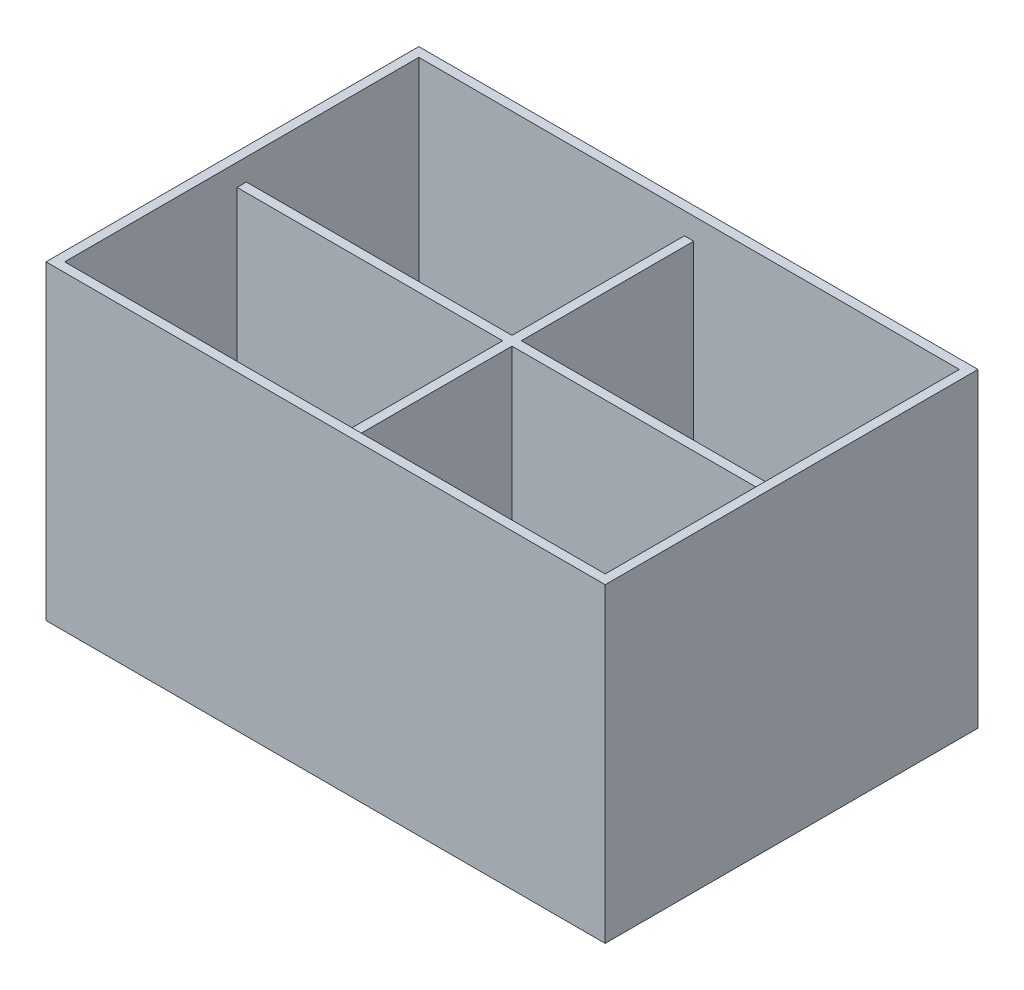
ISO-10303-21;
HEADER;
FILE_DESCRIPTION(('STEP AP214'),'2;1');
FILE_NAME('part.step','',(''),(''),'','','');
FILE_SCHEMA(('AUTOMOTIVE_DESIGN { 1 0 10303 214 1 1 1 1 }'));
ENDSEC;
DATA;
#1=APPLICATION_CONTEXT('core data for automotive mechanical design processes');
#2=APPLICATION_PROTOCOL_DEFINITION('international standard','automotive_design',2000,#1);
#3=PRODUCT_CONTEXT('',#1,'mechanical');
#4=PRODUCT('Part','Part','',(#3));
#5=PRODUCT_RELATED_PRODUCT_CATEGORY('part','',(#4));
#6=PRODUCT_DEFINITION_FORMATION('','',#4);
#7=PRODUCT_DEFINITION_CONTEXT('part definition',#1,'design');
#8=PRODUCT_DEFINITION('design','',#6,#7);
#9=PRODUCT_DEFINITION_SHAPE('','',#8);
#10=(LENGTH_UNIT() NAMED_UNIT(*) SI_UNIT(.MILLI.,.METRE.));
#11=(NAMED_UNIT(*) PLANE_ANGLE_UNIT() SI_UNIT($,.RADIAN.));
#12=(NAMED_UNIT(*) SI_UNIT($,.STERADIAN.) SOLID_ANGLE_UNIT());
#13=UNCERTAINTY_MEASURE_WITH_UNIT(LENGTH_MEASURE(1.E-05),#10,'distance_accuracy_value','');
#14=(GEOMETRIC_REPRESENTATION_CONTEXT(3) GLOBAL_UNCERTAINTY_ASSIGNED_CONTEXT((#13)) GLOBAL_UNIT_ASSIGNED_CONTEXT((#10,
#11,#12)) REPRESENTATION_CONTEXT('',''));
#15=CARTESIAN_POINT('',(0.,0.,0.));
#16=DIRECTION('',(0.,0.,1.));
#17=DIRECTION('',(1.,0.,0.));
#18=AXIS2_PLACEMENT_3D('',#15,#16,#17);
#19=CARTESIAN_POINT('',(0.,1.5,0.));
#20=DIRECTION('',(0.,1.,0.));
#21=DIRECTION('',(0.,0.,1.));
#22=AXIS2_PLACEMENT_3D('',#19,#20,#21);
#23=PLANE('',#22);
#24=DIRECTION('',(1.,0.,0.));
#25=VECTOR('',#24,1.);
#26=CARTESIAN_POINT('',(0.,1.5,0.749999999999972));
#27=LINE('',#26,#25);
#28=CARTESIAN_POINT('',(0.749999999999987,1.5,0.749999999999973));
#29=VERTEX_POINT('',#28);
#30=CARTESIAN_POINT('',(43.5,1.5,0.749999999999987));
#31=VERTEX_POINT('',#30);
#32=EDGE_CURVE('E52',#29,#31,#27,.T.);
#33=ORIENTED_EDGE('',*,*,#32,.F.);
#34=DIRECTION('',(0.,0.,-1.));
#35=VECTOR('',#34,1.);
#36=CARTESIAN_POINT('',(0.749999999999986,1.5,0.));
#37=LINE('',#36,#35);
#38=CARTESIAN_POINT('',(0.749999999999987,1.5,28.5));
#39=VERTEX_POINT('',#38);
#40=EDGE_CURVE('E198',#39,#29,#37,.T.);
#41=ORIENTED_EDGE('',*,*,#40,.F.);
#42=DIRECTION('',(1.,0.,0.));
#43=VECTOR('',#42,1.);
#44=CARTESIAN_POINT('',(-43.5,1.5,28.5));
#45=LINE('',#44,#43);
#46=CARTESIAN_POINT('',(43.5,1.5,28.5));
#47=VERTEX_POINT('',#46);
#48=EDGE_CURVE('E259',#39,#47,#45,.T.);
#49=ORIENTED_EDGE('',*,*,#48,.T.);
#50=DIRECTION('',(0.,0.,1.));
#51=VECTOR('',#50,1.);
#52=CARTESIAN_POINT('',(43.5,1.5,-28.5));
#53=LINE('',#52,#51);
#54=EDGE_CURVE('E262',#31,#47,#53,.T.);
#55=ORIENTED_EDGE('',*,*,#54,.F.);
#56=EDGE_LOOP('',(#33,#41,#49,#55));
#57=FACE_BOUND('',#56,.T.);
#58=ADVANCED_FACE('F37',(#57),#23,.T.);
#59=DIRECTION('',(1.,0.,0.));
#60=VECTOR('',#59,1.);
#61=CARTESIAN_POINT('',(0.,1.5,-0.750000000000029));
#62=LINE('',#61,#60);
#63=CARTESIAN_POINT('',(0.749999999999986,1.5,-0.750000000000028));
#64=VERTEX_POINT('',#63);
#65=CARTESIAN_POINT('',(43.5,1.5,-0.750000000000022));
#66=VERTEX_POINT('',#65);
#67=EDGE_CURVE('E289',#64,#66,#62,.T.);
#68=ORIENTED_EDGE('',*,*,#67,.T.);
#69=CARTESIAN_POINT('',(43.5,1.5,-28.5));
#70=VERTEX_POINT('',#69);
#71=EDGE_CURVE('E263',#70,#66,#53,.T.);
#72=ORIENTED_EDGE('',*,*,#71,.F.);
#73=DIRECTION('',(1.,0.,0.));
#74=VECTOR('',#73,1.);
#75=CARTESIAN_POINT('',(-43.5,1.5,-28.5));
#76=LINE('',#75,#74);
#77=CARTESIAN_POINT('',(0.749999999999994,1.5,-28.5));
#78=VERTEX_POINT('',#77);
#79=EDGE_CURVE('E45',#78,#70,#76,.T.);
#80=ORIENTED_EDGE('',*,*,#79,.F.);
#81=DIRECTION('',(0.,0.,-1.));
#82=VECTOR('',#81,1.);
#83=CARTESIAN_POINT('',(0.749999999999986,1.5,0.));
#84=LINE('',#83,#82);
#85=EDGE_CURVE('E60',#64,#78,#84,.T.);
#86=ORIENTED_EDGE('',*,*,#85,.F.);
#87=EDGE_LOOP('',(#68,#72,#80,#86));
#88=FACE_BOUND('',#87,.T.);
#89=ADVANCED_FACE('F287',(#88),#23,.T.);
#90=DIRECTION('',(0.,0.,-1.));
#91=VECTOR('',#90,1.);
#92=CARTESIAN_POINT('',(-0.750000000000015,1.5,0.));
#93=LINE('',#92,#91);
#94=CARTESIAN_POINT('',(-0.750000000000008,1.5,28.5));
#95=VERTEX_POINT('',#94);
#96=CARTESIAN_POINT('',(-0.750000000000014,1.5,0.749999999999973));
#97=VERTEX_POINT('',#96);
#98=EDGE_CURVE('E195',#95,#97,#93,.T.);
#99=ORIENTED_EDGE('',*,*,#98,.T.);
#100=DIRECTION('',(1.,0.,0.));
#101=VECTOR('',#100,1.);
#102=CARTESIAN_POINT('',(0.,1.5,0.749999999999972));
#103=LINE('',#102,#101);
#104=CARTESIAN_POINT('',(-43.5,1.5,0.74999999999998));
#105=VERTEX_POINT('',#104);
#106=EDGE_CURVE('E300',#105,#97,#103,.T.);
#107=ORIENTED_EDGE('',*,*,#106,.F.);
#108=DIRECTION('',(0.,0.,1.));
#109=VECTOR('',#108,1.);
#110=CARTESIAN_POINT('',(-43.5,1.5,-28.5));
#111=LINE('',#110,#109);
#112=CARTESIAN_POINT('',(-43.5,1.5,28.5));
#113=VERTEX_POINT('',#112);
#114=EDGE_CURVE('E255',#105,#113,#111,.T.);
#115=ORIENTED_EDGE('',*,*,#114,.T.);
#116=EDGE_CURVE('E260',#113,#95,#45,.T.);
#117=ORIENTED_EDGE('',*,*,#116,.T.);
#118=EDGE_LOOP('',(#99,#107,#115,#117));
#119=FACE_BOUND('',#118,.T.);
#120=ADVANCED_FACE('F362',(#119),#23,.T.);
#121=CARTESIAN_POINT('',(-43.5,50.,28.5));
#122=DIRECTION('',(0.,0.,-1.));
#123=DIRECTION('',(-1.,0.,0.));
#124=AXIS2_PLACEMENT_3D('',#121,#122,#123);
#125=PLANE('',#124);
#126=ORIENTED_EDGE('',*,*,#48,.F.);
#127=DIRECTION('',(0.,-1.,0.));
#128=VECTOR('',#127,1.);
#129=CARTESIAN_POINT('',(0.749999999999993,46.5,28.5));
#130=LINE('',#129,#128);
#131=CARTESIAN_POINT('',(0.749999999999987,46.5,28.5));
#132=VERTEX_POINT('',#131);
#133=EDGE_CURVE('E304',#132,#39,#130,.T.);
#134=ORIENTED_EDGE('',*,*,#133,.F.);
#135=DIRECTION('',(1.,0.,0.));
#136=VECTOR('',#135,1.);
#137=CARTESIAN_POINT('',(0.,46.5,28.5));
#138=LINE('',#137,#136);
#139=CARTESIAN_POINT('',(-0.750000000000008,46.5,28.5));
#140=VERTEX_POINT('',#139);
#141=EDGE_CURVE('E192',#140,#132,#138,.T.);
#142=ORIENTED_EDGE('',*,*,#141,.F.);
#143=DIRECTION('',(0.,-1.,0.));
#144=VECTOR('',#143,1.);
#145=CARTESIAN_POINT('',(-0.750000000000007,46.5,28.5));
#146=LINE('',#145,#144);
#147=EDGE_CURVE('E306',#140,#95,#146,.T.);
#148=ORIENTED_EDGE('',*,*,#147,.T.);
#149=ORIENTED_EDGE('',*,*,#116,.F.);
#150=DIRECTION('',(0.,-1.,0.));
#151=VECTOR('',#150,1.);
#152=CARTESIAN_POINT('',(-43.5,50.,28.5));
#153=LINE('',#152,#151);
#154=CARTESIAN_POINT('',(-43.5,50.,28.5));
#155=VERTEX_POINT('',#154);
#156=EDGE_CURVE('E222',#155,#113,#153,.T.);
#157=ORIENTED_EDGE('',*,*,#156,.F.);
#158=DIRECTION('',(1.,0.,0.));
#159=VECTOR('',#158,1.);
#160=CARTESIAN_POINT('',(-43.5,50.,28.5));
#161=LINE('',#160,#159);
#162=CARTESIAN_POINT('',(43.5,50.,28.5));
#163=VERTEX_POINT('',#162);
#164=EDGE_CURVE('E201',#155,#163,#161,.T.);
#165=ORIENTED_EDGE('',*,*,#164,.T.);
#166=DIRECTION('',(0.,-1.,0.));
#167=VECTOR('',#166,1.);
#168=CARTESIAN_POINT('',(43.5,50.,28.5));
#169=LINE('',#168,#167);
#170=EDGE_CURVE('E219',#163,#47,#169,.T.);
#171=ORIENTED_EDGE('',*,*,#170,.T.);
#172=EDGE_LOOP('',(#126,#134,#142,#148,#149,#157,#165,#171));
#173=FACE_BOUND('',#172,.T.);
#174=ADVANCED_FACE('F274',(#173),#125,.T.);
#175=CARTESIAN_POINT('',(43.5,50.,-28.5));
#176=DIRECTION('',(-1.,0.,0.));
#177=DIRECTION('',(0.,0.,1.));
#178=AXIS2_PLACEMENT_3D('',#175,#176,#177);
#179=PLANE('',#178);
#180=DIRECTION('',(0.,0.,-1.));
#181=VECTOR('',#180,1.);
#182=CARTESIAN_POINT('',(43.5,46.5,0.));
#183=LINE('',#182,#181);
#184=CARTESIAN_POINT('',(43.5,46.5,0.74999999999998));
#185=VERTEX_POINT('',#184);
#186=CARTESIAN_POINT('',(43.5,46.5,-0.750000000000015));
#187=VERTEX_POINT('',#186);
#188=EDGE_CURVE('E185',#185,#187,#183,.T.);
#189=ORIENTED_EDGE('',*,*,#188,.F.);
#190=DIRECTION('',(0.,-1.,0.));
#191=VECTOR('',#190,1.);
#192=CARTESIAN_POINT('',(43.5,46.5,0.749999999999986));
#193=LINE('',#192,#191);
#194=EDGE_CURVE('E182',#185,#31,#193,.T.);
#195=ORIENTED_EDGE('',*,*,#194,.T.);
#196=ORIENTED_EDGE('',*,*,#54,.T.);
#197=ORIENTED_EDGE('',*,*,#170,.F.);
#198=DIRECTION('',(0.,0.,-1.));
#199=VECTOR('',#198,1.);
#200=CARTESIAN_POINT('',(43.5,50.,-28.5));
#201=LINE('',#200,#199);
#202=CARTESIAN_POINT('',(43.5,50.,-28.5));
#203=VERTEX_POINT('',#202);
#204=EDGE_CURVE('E208',#163,#203,#201,.T.);
#205=ORIENTED_EDGE('',*,*,#204,.T.);
#206=DIRECTION('',(0.,-1.,0.));
#207=VECTOR('',#206,1.);
#208=CARTESIAN_POINT('',(43.5,50.,-28.5));
#209=LINE('',#208,#207);
#210=EDGE_CURVE('E216',#203,#70,#209,.T.);
#211=ORIENTED_EDGE('',*,*,#210,.T.);
#212=ORIENTED_EDGE('',*,*,#71,.T.);
#213=DIRECTION('',(0.,-1.,0.));
#214=VECTOR('',#213,1.);
#215=CARTESIAN_POINT('',(43.5,46.5,-0.750000000000014));
#216=LINE('',#215,#214);
#217=EDGE_CURVE('E203',#187,#66,#216,.T.);
#218=ORIENTED_EDGE('',*,*,#217,.F.);
#219=EDGE_LOOP('',(#189,#195,#196,#197,#205,#211,#212,#218));
#220=FACE_BOUND('',#219,.T.);
#221=ADVANCED_FACE('F270',(#220),#179,.T.);
#222=CARTESIAN_POINT('',(-43.5,50.,-28.5));
#223=DIRECTION('',(0.,0.,1.));
#224=DIRECTION('',(1.,0.,0.));
#225=AXIS2_PLACEMENT_3D('',#222,#223,#224);
#226=PLANE('',#225);
#227=DIRECTION('',(-1.,0.,0.));
#228=VECTOR('',#227,1.);
#229=CARTESIAN_POINT('',(0.,46.5,-28.5));
#230=LINE('',#229,#228);
#231=CARTESIAN_POINT('',(0.749999999999987,46.5,-28.5));
#232=VERTEX_POINT('',#231);
#233=CARTESIAN_POINT('',(-0.750000000000007,46.5,-28.5));
#234=VERTEX_POINT('',#233);
#235=EDGE_CURVE('E334',#232,#234,#230,.T.);
#236=ORIENTED_EDGE('',*,*,#235,.F.);
#237=DIRECTION('',(0.,-1.,0.));
#238=VECTOR('',#237,1.);
#239=CARTESIAN_POINT('',(0.749999999999993,46.5,-28.5));
#240=LINE('',#239,#238);
#241=EDGE_CURVE('E286',#232,#78,#240,.T.);
#242=ORIENTED_EDGE('',*,*,#241,.T.);
#243=ORIENTED_EDGE('',*,*,#79,.T.);
#244=ORIENTED_EDGE('',*,*,#210,.F.);
#245=DIRECTION('',(-1.,0.,0.));
#246=VECTOR('',#245,1.);
#247=CARTESIAN_POINT('',(-43.5,50.,-28.5));
#248=LINE('',#247,#246);
#249=CARTESIAN_POINT('',(-43.5,50.,-28.5));
#250=VERTEX_POINT('',#249);
#251=EDGE_CURVE('E211',#203,#250,#248,.T.);
#252=ORIENTED_EDGE('',*,*,#251,.T.);
#253=DIRECTION('',(0.,-1.,0.));
#254=VECTOR('',#253,1.);
#255=CARTESIAN_POINT('',(-43.5,50.,-28.5));
#256=LINE('',#255,#254);
#257=CARTESIAN_POINT('',(-43.5,1.5,-28.5));
#258=VERTEX_POINT('',#257);
#259=EDGE_CURVE('E213',#250,#258,#256,.T.);
#260=ORIENTED_EDGE('',*,*,#259,.T.);
#261=CARTESIAN_POINT('',(-0.750000000000008,1.5,-28.5));
#262=VERTEX_POINT('',#261);
#263=EDGE_CURVE('E11',#258,#262,#76,.T.);
#264=ORIENTED_EDGE('',*,*,#263,.T.);
#265=DIRECTION('',(0.,-1.,0.));
#266=VECTOR('',#265,1.);
#267=CARTESIAN_POINT('',(-0.750000000000007,46.5,-28.5));
#268=LINE('',#267,#266);
#269=EDGE_CURVE('E319',#234,#262,#268,.T.);
#270=ORIENTED_EDGE('',*,*,#269,.F.);
#271=EDGE_LOOP('',(#236,#242,#243,#244,#252,#260,#264,#270));
#272=FACE_BOUND('',#271,.T.);
#273=ADVANCED_FACE('F283',(#272),#226,.T.);
#274=DIRECTION('',(0.,0.,-1.));
#275=VECTOR('',#274,1.);
#276=CARTESIAN_POINT('',(-0.750000000000015,1.5,0.));
#277=LINE('',#276,#275);
#278=CARTESIAN_POINT('',(-0.750000000000014,1.5,-0.750000000000028));
#279=VERTEX_POINT('',#278);
#280=EDGE_CURVE('E292',#279,#262,#277,.T.);
#281=ORIENTED_EDGE('',*,*,#280,.T.);
#282=ORIENTED_EDGE('',*,*,#263,.F.);
#283=CARTESIAN_POINT('',(-43.5,1.5,-0.750000000000015));
#284=VERTEX_POINT('',#283);
#285=EDGE_CURVE('E256',#258,#284,#111,.T.);
#286=ORIENTED_EDGE('',*,*,#285,.T.);
#287=DIRECTION('',(1.,0.,0.));
#288=VECTOR('',#287,1.);
#289=CARTESIAN_POINT('',(0.,1.5,-0.750000000000029));
#290=LINE('',#289,#288);
#291=EDGE_CURVE('E298',#284,#279,#290,.T.);
#292=ORIENTED_EDGE('',*,*,#291,.T.);
#293=EDGE_LOOP('',(#281,#282,#286,#292));
#294=FACE_BOUND('',#293,.T.);
#295=ADVANCED_FACE('F375',(#294),#23,.T.);
#296=CARTESIAN_POINT('',(0.,50.,0.));
#297=DIRECTION('',(0.,1.,0.));
#298=DIRECTION('',(0.,0.,1.));
#299=AXIS2_PLACEMENT_3D('',#296,#297,#298);
#300=PLANE('',#299);
#301=DIRECTION('',(0.,0.,-1.));
#302=VECTOR('',#301,1.);
#303=CARTESIAN_POINT('',(45.,50.,-30.));
#304=LINE('',#303,#302);
#305=CARTESIAN_POINT('',(45.,50.,30.));
#306=VERTEX_POINT('',#305);
#307=CARTESIAN_POINT('',(45.,50.,-30.));
#308=VERTEX_POINT('',#307);
#309=EDGE_CURVE('E226',#306,#308,#304,.T.);
#310=ORIENTED_EDGE('',*,*,#309,.T.);
#311=DIRECTION('',(-1.,0.,0.));
#312=VECTOR('',#311,1.);
#313=CARTESIAN_POINT('',(-45.,50.,-30.));
#314=LINE('',#313,#312);
#315=CARTESIAN_POINT('',(-45.,50.,-30.));
#316=VERTEX_POINT('',#315);
#317=EDGE_CURVE('E229',#308,#316,#314,.T.);
#318=ORIENTED_EDGE('',*,*,#317,.T.);
#319=DIRECTION('',(0.,0.,1.));
#320=VECTOR('',#319,1.);
#321=CARTESIAN_POINT('',(-45.,50.,-30.));
#322=LINE('',#321,#320);
#323=CARTESIAN_POINT('',(-45.,50.,30.));
#324=VERTEX_POINT('',#323);
#325=EDGE_CURVE('E232',#316,#324,#322,.T.);
#326=ORIENTED_EDGE('',*,*,#325,.T.);
#327=DIRECTION('',(1.,0.,0.));
#328=VECTOR('',#327,1.);
#329=CARTESIAN_POINT('',(-45.,50.,30.));
#330=LINE('',#329,#328);
#331=EDGE_CURVE('E234',#324,#306,#330,.T.);
#332=ORIENTED_EDGE('',*,*,#331,.T.);
#333=EDGE_LOOP('',(#310,#318,#326,#332));
#334=FACE_BOUND('',#333,.T.);
#335=ORIENTED_EDGE('',*,*,#164,.F.);
#336=DIRECTION('',(0.,0.,1.));
#337=VECTOR('',#336,1.);
#338=CARTESIAN_POINT('',(-43.5,50.,-28.5));
#339=LINE('',#338,#337);
#340=EDGE_CURVE('E199',#250,#155,#339,.T.);
#341=ORIENTED_EDGE('',*,*,#340,.F.);
#342=ORIENTED_EDGE('',*,*,#251,.F.);
#343=ORIENTED_EDGE('',*,*,#204,.F.);
#344=EDGE_LOOP('',(#335,#341,#342,#343));
#345=FACE_BOUND('',#344,.T.);
#346=ADVANCED_FACE('F280',(#334,#345),#300,.T.);
#347=CARTESIAN_POINT('',(45.,50.,-30.));
#348=DIRECTION('',(-1.,0.,0.));
#349=DIRECTION('',(0.,0.,1.));
#350=AXIS2_PLACEMENT_3D('',#347,#348,#349);
#351=PLANE('',#350);
#352=DIRECTION('',(0.,0.,-1.));
#353=VECTOR('',#352,1.);
#354=CARTESIAN_POINT('',(45.,0.,-30.));
#355=LINE('',#354,#353);
#356=CARTESIAN_POINT('',(45.,0.,30.));
#357=VERTEX_POINT('',#356);
#358=CARTESIAN_POINT('',(45.,0.,-30.));
#359=VERTEX_POINT('',#358);
#360=EDGE_CURVE('E225',#357,#359,#355,.T.);
#361=ORIENTED_EDGE('',*,*,#360,.T.);
#362=DIRECTION('',(0.,-1.,0.));
#363=VECTOR('',#362,1.);
#364=CARTESIAN_POINT('',(45.,50.,-30.));
#365=LINE('',#364,#363);
#366=EDGE_CURVE('E252',#308,#359,#365,.T.);
#367=ORIENTED_EDGE('',*,*,#366,.F.);
#368=ORIENTED_EDGE('',*,*,#309,.F.);
#369=DIRECTION('',(0.,-1.,0.));
#370=VECTOR('',#369,1.);
#371=CARTESIAN_POINT('',(45.,50.,30.));
#372=LINE('',#371,#370);
#373=EDGE_CURVE('E236',#306,#357,#372,.T.);
#374=ORIENTED_EDGE('',*,*,#373,.T.);
#375=EDGE_LOOP('',(#361,#367,#368,#374));
#376=FACE_BOUND('',#375,.T.);
#377=ADVANCED_FACE('F381',(#376),#351,.F.);
#378=CARTESIAN_POINT('',(-45.,50.,-30.));
#379=DIRECTION('',(0.,0.,1.));
#380=DIRECTION('',(1.,0.,0.));
#381=AXIS2_PLACEMENT_3D('',#378,#379,#380);
#382=PLANE('',#381);
#383=DIRECTION('',(-1.,0.,0.));
#384=VECTOR('',#383,1.);
#385=CARTESIAN_POINT('',(-45.,0.,-30.));
#386=LINE('',#385,#384);
#387=CARTESIAN_POINT('',(-45.,0.,-30.));
#388=VERTEX_POINT('',#387);
#389=EDGE_CURVE('E239',#359,#388,#386,.T.);
#390=ORIENTED_EDGE('',*,*,#389,.T.);
#391=DIRECTION('',(0.,-1.,0.));
#392=VECTOR('',#391,1.);
#393=CARTESIAN_POINT('',(-45.,50.,-30.));
#394=LINE('',#393,#392);
#395=EDGE_CURVE('E249',#316,#388,#394,.T.);
#396=ORIENTED_EDGE('',*,*,#395,.F.);
#397=ORIENTED_EDGE('',*,*,#317,.F.);
#398=ORIENTED_EDGE('',*,*,#366,.T.);
#399=EDGE_LOOP('',(#390,#396,#397,#398));
#400=FACE_BOUND('',#399,.T.);
#401=ADVANCED_FACE('F433',(#400),#382,.F.);
#402=CARTESIAN_POINT('',(-45.,50.,-30.));
#403=DIRECTION('',(1.,0.,0.));
#404=DIRECTION('',(0.,0.,-1.));
#405=AXIS2_PLACEMENT_3D('',#402,#403,#404);
#406=PLANE('',#405);
#407=DIRECTION('',(0.,0.,1.));
#408=VECTOR('',#407,1.);
#409=CARTESIAN_POINT('',(-45.,0.,-30.));
#410=LINE('',#409,#408);
#411=CARTESIAN_POINT('',(-45.,0.,30.));
#412=VERTEX_POINT('',#411);
#413=EDGE_CURVE('E241',#388,#412,#410,.T.);
#414=ORIENTED_EDGE('',*,*,#413,.T.);
#415=DIRECTION('',(0.,-1.,0.));
#416=VECTOR('',#415,1.);
#417=CARTESIAN_POINT('',(-45.,50.,30.));
#418=LINE('',#417,#416);
#419=EDGE_CURVE('E246',#324,#412,#418,.T.);
#420=ORIENTED_EDGE('',*,*,#419,.F.);
#421=ORIENTED_EDGE('',*,*,#325,.F.);
#422=ORIENTED_EDGE('',*,*,#395,.T.);
#423=EDGE_LOOP('',(#414,#420,#421,#422));
#424=FACE_BOUND('',#423,.T.);
#425=ADVANCED_FACE('F423',(#424),#406,.F.);
#426=CARTESIAN_POINT('',(-45.,50.,30.));
#427=DIRECTION('',(0.,0.,-1.));
#428=DIRECTION('',(-1.,0.,0.));
#429=AXIS2_PLACEMENT_3D('',#426,#427,#428);
#430=PLANE('',#429);
#431=DIRECTION('',(1.,0.,0.));
#432=VECTOR('',#431,1.);
#433=CARTESIAN_POINT('',(-45.,0.,30.));
#434=LINE('',#433,#432);
#435=EDGE_CURVE('E230',#412,#357,#434,.T.);
#436=ORIENTED_EDGE('',*,*,#435,.T.);
#437=ORIENTED_EDGE('',*,*,#373,.F.);
#438=ORIENTED_EDGE('',*,*,#331,.F.);
#439=ORIENTED_EDGE('',*,*,#419,.T.);
#440=EDGE_LOOP('',(#436,#437,#438,#439));
#441=FACE_BOUND('',#440,.T.);
#442=ADVANCED_FACE('F418',(#441),#430,.F.);
#443=CARTESIAN_POINT('',(-43.5,50.,-28.5));
#444=DIRECTION('',(1.,0.,0.));
#445=DIRECTION('',(0.,0.,-1.));
#446=AXIS2_PLACEMENT_3D('',#443,#444,#445);
#447=PLANE('',#446);
#448=DIRECTION('',(0.,-1.,0.));
#449=VECTOR('',#448,1.);
#450=CARTESIAN_POINT('',(-43.5,46.5,-0.750000000000014));
#451=LINE('',#450,#449);
#452=CARTESIAN_POINT('',(-43.5,46.5,-0.750000000000022));
#453=VERTEX_POINT('',#452);
#454=EDGE_CURVE('E314',#453,#284,#451,.T.);
#455=ORIENTED_EDGE('',*,*,#454,.T.);
#456=ORIENTED_EDGE('',*,*,#285,.F.);
#457=ORIENTED_EDGE('',*,*,#259,.F.);
#458=ORIENTED_EDGE('',*,*,#340,.T.);
#459=ORIENTED_EDGE('',*,*,#156,.T.);
#460=ORIENTED_EDGE('',*,*,#114,.F.);
#461=DIRECTION('',(0.,-1.,0.));
#462=VECTOR('',#461,1.);
#463=CARTESIAN_POINT('',(-43.5,46.5,0.749999999999986));
#464=LINE('',#463,#462);
#465=CARTESIAN_POINT('',(-43.5,46.5,0.749999999999987));
#466=VERTEX_POINT('',#465);
#467=EDGE_CURVE('E311',#466,#105,#464,.T.);
#468=ORIENTED_EDGE('',*,*,#467,.F.);
#469=DIRECTION('',(0.,0.,1.));
#470=VECTOR('',#469,1.);
#471=CARTESIAN_POINT('',(-43.5,46.5,0.));
#472=LINE('',#471,#470);
#473=EDGE_CURVE('E343',#453,#466,#472,.T.);
#474=ORIENTED_EDGE('',*,*,#473,.F.);
#475=EDGE_LOOP('',(#455,#456,#457,#458,#459,#460,#468,#474));
#476=FACE_BOUND('',#475,.T.);
#477=ADVANCED_FACE('F364',(#476),#447,.T.);
#478=CARTESIAN_POINT('',(0.,0.,0.));
#479=DIRECTION('',(0.,1.,0.));
#480=DIRECTION('',(0.,0.,1.));
#481=AXIS2_PLACEMENT_3D('',#478,#479,#480);
#482=PLANE('',#481);
#483=ORIENTED_EDGE('',*,*,#360,.F.);
#484=ORIENTED_EDGE('',*,*,#435,.F.);
#485=ORIENTED_EDGE('',*,*,#413,.F.);
#486=ORIENTED_EDGE('',*,*,#389,.F.);
#487=EDGE_LOOP('',(#483,#484,#485,#486));
#488=FACE_BOUND('',#487,.T.);
#489=ADVANCED_FACE('F39',(#488),#482,.F.);
#490=CARTESIAN_POINT('',(0.749999999999986,46.5,0.));
#491=DIRECTION('',(-1.,0.,0.));
#492=DIRECTION('',(0.,0.,1.));
#493=AXIS2_PLACEMENT_3D('',#490,#491,#492);
#494=PLANE('',#493);
#495=ORIENTED_EDGE('',*,*,#40,.T.);
#496=DIRECTION('',(0.,-1.,0.));
#497=VECTOR('',#496,1.);
#498=CARTESIAN_POINT('',(0.749999999999987,46.5,0.749999999999973));
#499=LINE('',#498,#497);
#500=CARTESIAN_POINT('',(0.749999999999987,46.5,0.749999999999973));
#501=VERTEX_POINT('',#500);
#502=EDGE_CURVE('E180',#501,#29,#499,.T.);
#503=ORIENTED_EDGE('',*,*,#502,.F.);
#504=DIRECTION('',(0.,0.,-1.));
#505=VECTOR('',#504,1.);
#506=CARTESIAN_POINT('',(0.749999999999986,46.5,0.));
#507=LINE('',#506,#505);
#508=EDGE_CURVE('E186',#132,#501,#507,.T.);
#509=ORIENTED_EDGE('',*,*,#508,.F.);
#510=ORIENTED_EDGE('',*,*,#133,.T.);
#511=EDGE_LOOP('',(#495,#503,#509,#510));
#512=FACE_BOUND('',#511,.T.);
#513=ADVANCED_FACE('F197',(#512),#494,.F.);
#514=CARTESIAN_POINT('',(0.,46.5,0.749999999999972));
#515=DIRECTION('',(0.,0.,-1.));
#516=DIRECTION('',(-1.,0.,0.));
#517=AXIS2_PLACEMENT_3D('',#514,#515,#516);
#518=PLANE('',#517);
#519=ORIENTED_EDGE('',*,*,#32,.T.);
#520=ORIENTED_EDGE('',*,*,#194,.F.);
#521=DIRECTION('',(1.,0.,0.));
#522=VECTOR('',#521,1.);
#523=CARTESIAN_POINT('',(0.,46.5,0.749999999999972));
#524=LINE('',#523,#522);
#525=EDGE_CURVE('E176',#501,#185,#524,.T.);
#526=ORIENTED_EDGE('',*,*,#525,.F.);
#527=ORIENTED_EDGE('',*,*,#502,.T.);
#528=EDGE_LOOP('',(#519,#520,#526,#527));
#529=FACE_BOUND('',#528,.T.);
#530=ADVANCED_FACE('F178',(#529),#518,.F.);
#531=CARTESIAN_POINT('',(0.,46.5,-0.750000000000029));
#532=DIRECTION('',(0.,0.,-1.));
#533=DIRECTION('',(-1.,0.,0.));
#534=AXIS2_PLACEMENT_3D('',#531,#532,#533);
#535=PLANE('',#534);
#536=ORIENTED_EDGE('',*,*,#67,.F.);
#537=DIRECTION('',(0.,-1.,0.));
#538=VECTOR('',#537,1.);
#539=CARTESIAN_POINT('',(0.749999999999986,46.5,-0.750000000000028));
#540=LINE('',#539,#538);
#541=CARTESIAN_POINT('',(0.749999999999986,46.5,-0.750000000000028));
#542=VERTEX_POINT('',#541);
#543=EDGE_CURVE('E323',#542,#64,#540,.T.);
#544=ORIENTED_EDGE('',*,*,#543,.F.);
#545=DIRECTION('',(1.,0.,0.));
#546=VECTOR('',#545,1.);
#547=CARTESIAN_POINT('',(0.,46.5,-0.750000000000029));
#548=LINE('',#547,#546);
#549=EDGE_CURVE('E327',#542,#187,#548,.T.);
#550=ORIENTED_EDGE('',*,*,#549,.T.);
#551=ORIENTED_EDGE('',*,*,#217,.T.);
#552=EDGE_LOOP('',(#536,#544,#550,#551));
#553=FACE_BOUND('',#552,.T.);
#554=ADVANCED_FACE('F325',(#553),#535,.T.);
#555=CARTESIAN_POINT('',(0.749999999999986,46.5,0.));
#556=DIRECTION('',(-1.,0.,0.));
#557=DIRECTION('',(0.,0.,1.));
#558=AXIS2_PLACEMENT_3D('',#555,#556,#557);
#559=PLANE('',#558);
#560=ORIENTED_EDGE('',*,*,#85,.T.);
#561=ORIENTED_EDGE('',*,*,#241,.F.);
#562=DIRECTION('',(0.,0.,-1.));
#563=VECTOR('',#562,1.);
#564=CARTESIAN_POINT('',(0.749999999999986,46.5,0.));
#565=LINE('',#564,#563);
#566=EDGE_CURVE('E330',#542,#232,#565,.T.);
#567=ORIENTED_EDGE('',*,*,#566,.F.);
#568=ORIENTED_EDGE('',*,*,#543,.T.);
#569=EDGE_LOOP('',(#560,#561,#567,#568));
#570=FACE_BOUND('',#569,.T.);
#571=ADVANCED_FACE('F495',(#570),#559,.F.);
#572=CARTESIAN_POINT('',(-0.750000000000015,46.5,0.));
#573=DIRECTION('',(-1.,0.,0.));
#574=DIRECTION('',(0.,0.,1.));
#575=AXIS2_PLACEMENT_3D('',#572,#573,#574);
#576=PLANE('',#575);
#577=ORIENTED_EDGE('',*,*,#280,.F.);
#578=DIRECTION('',(0.,-1.,0.));
#579=VECTOR('',#578,1.);
#580=CARTESIAN_POINT('',(-0.750000000000014,46.5,-0.750000000000028));
#581=LINE('',#580,#579);
#582=CARTESIAN_POINT('',(-0.750000000000014,46.5,-0.750000000000028));
#583=VERTEX_POINT('',#582);
#584=EDGE_CURVE('E316',#583,#279,#581,.T.);
#585=ORIENTED_EDGE('',*,*,#584,.F.);
#586=DIRECTION('',(0.,0.,-1.));
#587=VECTOR('',#586,1.);
#588=CARTESIAN_POINT('',(-0.750000000000015,46.5,0.));
#589=LINE('',#588,#587);
#590=EDGE_CURVE('E337',#583,#234,#589,.T.);
#591=ORIENTED_EDGE('',*,*,#590,.T.);
#592=ORIENTED_EDGE('',*,*,#269,.T.);
#593=EDGE_LOOP('',(#577,#585,#591,#592));
#594=FACE_BOUND('',#593,.T.);
#595=ADVANCED_FACE('F369',(#594),#576,.T.);
#596=CARTESIAN_POINT('',(0.,46.5,-0.750000000000029));
#597=DIRECTION('',(0.,0.,-1.));
#598=DIRECTION('',(-1.,0.,0.));
#599=AXIS2_PLACEMENT_3D('',#596,#597,#598);
#600=PLANE('',#599);
#601=ORIENTED_EDGE('',*,*,#291,.F.);
#602=ORIENTED_EDGE('',*,*,#454,.F.);
#603=DIRECTION('',(1.,0.,0.));
#604=VECTOR('',#603,1.);
#605=CARTESIAN_POINT('',(0.,46.5,-0.750000000000029));
#606=LINE('',#605,#604);
#607=EDGE_CURVE('E340',#453,#583,#606,.T.);
#608=ORIENTED_EDGE('',*,*,#607,.T.);
#609=ORIENTED_EDGE('',*,*,#584,.T.);
#610=EDGE_LOOP('',(#601,#602,#608,#609));
#611=FACE_BOUND('',#610,.T.);
#612=ADVANCED_FACE('F374',(#611),#600,.T.);
#613=CARTESIAN_POINT('',(0.,46.5,0.749999999999972));
#614=DIRECTION('',(0.,0.,-1.));
#615=DIRECTION('',(-1.,0.,0.));
#616=AXIS2_PLACEMENT_3D('',#613,#614,#615);
#617=PLANE('',#616);
#618=ORIENTED_EDGE('',*,*,#106,.T.);
#619=DIRECTION('',(0.,-1.,0.));
#620=VECTOR('',#619,1.);
#621=CARTESIAN_POINT('',(-0.750000000000014,46.5,0.749999999999973));
#622=LINE('',#621,#620);
#623=CARTESIAN_POINT('',(-0.750000000000014,46.5,0.749999999999973));
#624=VERTEX_POINT('',#623);
#625=EDGE_CURVE('E308',#624,#97,#622,.T.);
#626=ORIENTED_EDGE('',*,*,#625,.F.);
#627=DIRECTION('',(1.,0.,0.));
#628=VECTOR('',#627,1.);
#629=CARTESIAN_POINT('',(0.,46.5,0.749999999999972));
#630=LINE('',#629,#628);
#631=EDGE_CURVE('E346',#466,#624,#630,.T.);
#632=ORIENTED_EDGE('',*,*,#631,.F.);
#633=ORIENTED_EDGE('',*,*,#467,.T.);
#634=EDGE_LOOP('',(#618,#626,#632,#633));
#635=FACE_BOUND('',#634,.T.);
#636=ADVANCED_FACE('F359',(#635),#617,.F.);
#637=CARTESIAN_POINT('',(-0.750000000000015,46.5,0.));
#638=DIRECTION('',(-1.,0.,0.));
#639=DIRECTION('',(0.,0.,1.));
#640=AXIS2_PLACEMENT_3D('',#637,#638,#639);
#641=PLANE('',#640);
#642=ORIENTED_EDGE('',*,*,#98,.F.);
#643=ORIENTED_EDGE('',*,*,#147,.F.);
#644=DIRECTION('',(0.,0.,-1.));
#645=VECTOR('',#644,1.);
#646=CARTESIAN_POINT('',(-0.750000000000015,46.5,0.));
#647=LINE('',#646,#645);
#648=EDGE_CURVE('E348',#140,#624,#647,.T.);
#649=ORIENTED_EDGE('',*,*,#648,.T.);
#650=ORIENTED_EDGE('',*,*,#625,.T.);
#651=EDGE_LOOP('',(#642,#643,#649,#650));
#652=FACE_BOUND('',#651,.T.);
#653=ADVANCED_FACE('F354',(#652),#641,.T.);
#654=CARTESIAN_POINT('',(0.,46.5,0.));
#655=DIRECTION('',(0.,1.,0.));
#656=DIRECTION('',(0.,0.,1.));
#657=AXIS2_PLACEMENT_3D('',#654,#655,#656);
#658=PLANE('',#657);
#659=ORIENTED_EDGE('',*,*,#508,.T.);
#660=ORIENTED_EDGE('',*,*,#525,.T.);
#661=ORIENTED_EDGE('',*,*,#188,.T.);
#662=ORIENTED_EDGE('',*,*,#549,.F.);
#663=ORIENTED_EDGE('',*,*,#566,.T.);
#664=ORIENTED_EDGE('',*,*,#235,.T.);
#665=ORIENTED_EDGE('',*,*,#590,.F.);
#666=ORIENTED_EDGE('',*,*,#607,.F.);
#667=ORIENTED_EDGE('',*,*,#473,.T.);
#668=ORIENTED_EDGE('',*,*,#631,.T.);
#669=ORIENTED_EDGE('',*,*,#648,.F.);
#670=ORIENTED_EDGE('',*,*,#141,.T.);
#671=EDGE_LOOP('',(#659,#660,#661,#662,#663,#664,#665,#666,#667,#668,#669,#670));
#672=FACE_BOUND('',#671,.T.);
#673=ADVANCED_FACE('F190',(#672),#658,.T.);
#674=CLOSED_SHELL('',(#58,#89,#120,#174,#221,#273,#295,#346,#377,#401,#425,#442,#477,#489,#513,
#530,#554,#571,#595,#612,#636,#653,#673));
#675=MANIFOLD_SOLID_BREP('B2',#674);
#676=ADVANCED_BREP_SHAPE_REPRESENTATION('',(#18,#675),#14);
#677=SHAPE_DEFINITION_REPRESENTATION(#9,#676);
ENDSEC;
END-ISO-10303-21;
